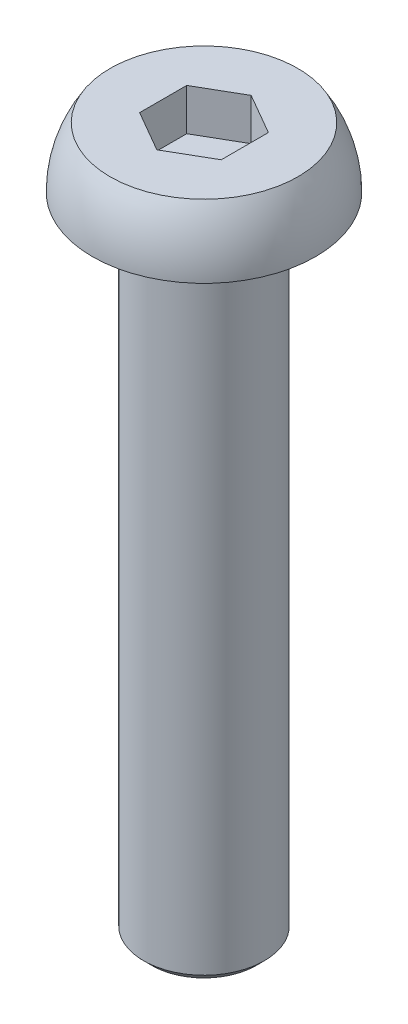
ISO-10303-21;
HEADER;
FILE_DESCRIPTION(('STEP AP214'),'2;1');
FILE_NAME('part.step','',(''),(''),'','','');
FILE_SCHEMA(('AUTOMOTIVE_DESIGN { 1 0 10303 214 1 1 1 1 }'));
ENDSEC;
DATA;
#1=APPLICATION_CONTEXT('core data for automotive mechanical design processes');
#2=APPLICATION_PROTOCOL_DEFINITION('international standard','automotive_design',2000,#1);
#3=PRODUCT_CONTEXT('',#1,'mechanical');
#4=PRODUCT('Part','Part','',(#3));
#5=PRODUCT_RELATED_PRODUCT_CATEGORY('part','',(#4));
#6=PRODUCT_DEFINITION_FORMATION('','',#4);
#7=PRODUCT_DEFINITION_CONTEXT('part definition',#1,'design');
#8=PRODUCT_DEFINITION('design','',#6,#7);
#9=PRODUCT_DEFINITION_SHAPE('','',#8);
#10=(LENGTH_UNIT() NAMED_UNIT(*) SI_UNIT(.MILLI.,.METRE.));
#11=(NAMED_UNIT(*) PLANE_ANGLE_UNIT() SI_UNIT($,.RADIAN.));
#12=(NAMED_UNIT(*) SI_UNIT($,.STERADIAN.) SOLID_ANGLE_UNIT());
#13=UNCERTAINTY_MEASURE_WITH_UNIT(LENGTH_MEASURE(1.E-05),#10,'distance_accuracy_value','');
#14=(GEOMETRIC_REPRESENTATION_CONTEXT(3) GLOBAL_UNCERTAINTY_ASSIGNED_CONTEXT((#13)) GLOBAL_UNIT_ASSIGNED_CONTEXT((#10,
#11,#12)) REPRESENTATION_CONTEXT('',''));
#15=CARTESIAN_POINT('',(0.,0.,0.));
#16=DIRECTION('',(0.,0.,1.));
#17=DIRECTION('',(1.,0.,0.));
#18=AXIS2_PLACEMENT_3D('',#15,#16,#17);
#19=CARTESIAN_POINT('',(-2.33465736244101,1.5,0.));
#20=DIRECTION('',(0.,1.,0.));
#21=DIRECTION('',(0.,0.,1.));
#22=AXIS2_PLACEMENT_3D('',#19,#20,#21);
#23=PLANE('',#22);
#24=DIRECTION('',(-0.866025403784439,0.,-0.5));
#25=VECTOR('',#24,1.);
#26=CARTESIAN_POINT('',(1.015,1.5,-0.58601052322747));
#27=LINE('',#26,#25);
#28=CARTESIAN_POINT('',(1.015,1.5,-0.58601052322747));
#29=VERTEX_POINT('',#28);
#30=CARTESIAN_POINT('',(0.,1.5,-1.17202104645494));
#31=VERTEX_POINT('',#30);
#32=EDGE_CURVE('E58',#29,#31,#27,.T.);
#33=ORIENTED_EDGE('',*,*,#32,.F.);
#34=DIRECTION('',(0.,0.,-1.));
#35=VECTOR('',#34,1.);
#36=CARTESIAN_POINT('',(1.015,1.5,0.58601052322747));
#37=LINE('',#36,#35);
#38=CARTESIAN_POINT('',(1.015,1.5,0.58601052322747));
#39=VERTEX_POINT('',#38);
#40=EDGE_CURVE('E151',#39,#29,#37,.T.);
#41=ORIENTED_EDGE('',*,*,#40,.F.);
#42=DIRECTION('',(0.866025403784439,0.,-0.5));
#43=VECTOR('',#42,1.);
#44=CARTESIAN_POINT('',(0.,1.5,1.17202104645494));
#45=LINE('',#44,#43);
#46=CARTESIAN_POINT('',(0.,1.5,1.17202104645494));
#47=VERTEX_POINT('',#46);
#48=EDGE_CURVE('E148',#47,#39,#45,.T.);
#49=ORIENTED_EDGE('',*,*,#48,.F.);
#50=DIRECTION('',(0.866025403784439,0.,0.5));
#51=VECTOR('',#50,1.);
#52=CARTESIAN_POINT('',(-1.015,1.5,0.58601052322747));
#53=LINE('',#52,#51);
#54=CARTESIAN_POINT('',(-1.015,1.5,0.58601052322747));
#55=VERTEX_POINT('',#54);
#56=EDGE_CURVE('E106',#55,#47,#53,.T.);
#57=ORIENTED_EDGE('',*,*,#56,.F.);
#58=DIRECTION('',(0.,0.,1.));
#59=VECTOR('',#58,1.);
#60=CARTESIAN_POINT('',(-1.015,1.5,-0.58601052322747));
#61=LINE('',#60,#59);
#62=CARTESIAN_POINT('',(-1.015,1.5,-0.58601052322747));
#63=VERTEX_POINT('',#62);
#64=EDGE_CURVE('E142',#63,#55,#61,.T.);
#65=ORIENTED_EDGE('',*,*,#64,.F.);
#66=DIRECTION('',(-0.866025403784439,0.,0.5));
#67=VECTOR('',#66,1.);
#68=CARTESIAN_POINT('',(0.,1.5,-1.17202104645494));
#69=LINE('',#68,#67);
#70=EDGE_CURVE('E138',#31,#63,#69,.T.);
#71=ORIENTED_EDGE('',*,*,#70,.F.);
#72=EDGE_LOOP('',(#33,#41,#49,#57,#65,#71));
#73=FACE_BOUND('',#72,.T.);
#74=CARTESIAN_POINT('',(0.,1.5,0.));
#75=DIRECTION('',(0.,1.,0.));
#76=DIRECTION('',(0.,0.,1.));
#77=AXIS2_PLACEMENT_3D('',#74,#75,#76);
#78=CIRCLE('',#77,2.33465736244101);
#79=CARTESIAN_POINT('',(0.,1.5,2.33465736244101));
#80=VERTEX_POINT('',#79);
#81=EDGE_CURVE('E171',#80,#80,#78,.T.);
#82=ORIENTED_EDGE('',*,*,#81,.T.);
#83=EDGE_LOOP('',(#82));
#84=FACE_BOUND('',#83,.T.);
#85=ADVANCED_FACE('F41',(#73,#84),#23,.T.);
#86=CARTESIAN_POINT('',(0.,0.,0.));
#87=DIRECTION('',(0.,1.,0.));
#88=DIRECTION('',(-1.,0.,0.));
#89=AXIS2_PLACEMENT_3D('',#86,#87,#88);
#90=SPHERICAL_SURFACE('',#89,2.775);
#91=CARTESIAN_POINT('',(0.,0.,0.));
#92=DIRECTION('',(0.,1.,0.));
#93=DIRECTION('',(0.,0.,1.));
#94=AXIS2_PLACEMENT_3D('',#91,#92,#93);
#95=CIRCLE('',#94,2.775);
#96=CARTESIAN_POINT('',(0.,0.,2.775));
#97=VERTEX_POINT('',#96);
#98=EDGE_CURVE('E157',#97,#97,#95,.T.);
#99=ORIENTED_EDGE('',*,*,#98,.T.);
#100=EDGE_LOOP('',(#99));
#101=FACE_BOUND('',#100,.T.);
#102=ORIENTED_EDGE('',*,*,#81,.F.);
#103=EDGE_LOOP('',(#102));
#104=FACE_BOUND('',#103,.T.);
#105=ADVANCED_FACE('F192',(#101,#104),#90,.T.);
#106=CARTESIAN_POINT('',(0.,0.,0.));
#107=DIRECTION('',(0.,-1.,0.));
#108=DIRECTION('',(0.,0.,-1.));
#109=AXIS2_PLACEMENT_3D('',#106,#107,#108);
#110=PLANE('',#109);
#111=CARTESIAN_POINT('',(0.,0.,0.));
#112=DIRECTION('',(0.,-1.,0.));
#113=DIRECTION('',(0.,0.,-1.));
#114=AXIS2_PLACEMENT_3D('',#111,#112,#113);
#115=CIRCLE('',#114,1.5);
#116=CARTESIAN_POINT('',(0.,0.,-1.5));
#117=VERTEX_POINT('',#116);
#118=EDGE_CURVE('E167',#117,#117,#115,.T.);
#119=ORIENTED_EDGE('',*,*,#118,.F.);
#120=EDGE_LOOP('',(#119));
#121=FACE_BOUND('',#120,.T.);
#122=ORIENTED_EDGE('',*,*,#98,.F.);
#123=EDGE_LOOP('',(#122));
#124=FACE_BOUND('',#123,.T.);
#125=ADVANCED_FACE('F197',(#121,#124),#110,.T.);
#126=CARTESIAN_POINT('',(0.,-16.,0.));
#127=DIRECTION('',(0.,1.,0.));
#128=DIRECTION('',(0.,0.,1.));
#129=AXIS2_PLACEMENT_3D('',#126,#127,#128);
#130=CYLINDRICAL_SURFACE('',#129,1.5);
#131=CARTESIAN_POINT('',(0.,-15.8,0.));
#132=DIRECTION('',(0.,-1.,0.));
#133=DIRECTION('',(0.,0.,-1.));
#134=AXIS2_PLACEMENT_3D('',#131,#132,#133);
#135=CIRCLE('',#134,1.5);
#136=CARTESIAN_POINT('',(0.,-15.8,-1.5));
#137=VERTEX_POINT('',#136);
#138=EDGE_CURVE('E11',#137,#137,#135,.F.);
#139=ORIENTED_EDGE('',*,*,#138,.T.);
#140=EDGE_LOOP('',(#139));
#141=FACE_BOUND('',#140,.T.);
#142=ORIENTED_EDGE('',*,*,#118,.T.);
#143=EDGE_LOOP('',(#142));
#144=FACE_BOUND('',#143,.T.);
#145=ADVANCED_FACE('F204',(#141,#144),#130,.T.);
#146=CARTESIAN_POINT('',(0.,-16.,0.));
#147=DIRECTION('',(0.,-1.,0.));
#148=DIRECTION('',(0.,0.,-1.));
#149=AXIS2_PLACEMENT_3D('',#146,#147,#148);
#150=PLANE('',#149);
#151=CARTESIAN_POINT('',(0.,-16.,0.));
#152=DIRECTION('',(0.,-1.,0.));
#153=DIRECTION('',(0.,0.,-1.));
#154=AXIS2_PLACEMENT_3D('',#151,#152,#153);
#155=CIRCLE('',#154,1.3);
#156=CARTESIAN_POINT('',(0.,-16.,-1.3));
#157=VERTEX_POINT('',#156);
#158=EDGE_CURVE('E51',#157,#157,#155,.T.);
#159=ORIENTED_EDGE('',*,*,#158,.T.);
#160=EDGE_LOOP('',(#159));
#161=FACE_BOUND('',#160,.T.);
#162=ADVANCED_FACE('F181',(#161),#150,.T.);
#163=CARTESIAN_POINT('',(1.015,0.459999999999999,-0.58601052322747));
#164=DIRECTION('',(0.5,0.,-0.866025403784439));
#165=DIRECTION('',(-0.866025403784439,0.,-0.5));
#166=AXIS2_PLACEMENT_3D('',#163,#164,#165);
#167=PLANE('',#166);
#168=ORIENTED_EDGE('',*,*,#32,.T.);
#169=DIRECTION('',(0.,1.,0.));
#170=VECTOR('',#169,1.);
#171=CARTESIAN_POINT('',(0.,0.459999999999999,-1.17202104645494));
#172=LINE('',#171,#170);
#173=CARTESIAN_POINT('',(0.,0.459999999999999,-1.17202104645494));
#174=VERTEX_POINT('',#173);
#175=EDGE_CURVE('E88',#174,#31,#172,.T.);
#176=ORIENTED_EDGE('',*,*,#175,.F.);
#177=DIRECTION('',(-0.866025403784439,0.,-0.5));
#178=VECTOR('',#177,1.);
#179=CARTESIAN_POINT('',(1.015,0.459999999999999,-0.58601052322747));
#180=LINE('',#179,#178);
#181=CARTESIAN_POINT('',(1.015,0.459999999999999,-0.58601052322747));
#182=VERTEX_POINT('',#181);
#183=EDGE_CURVE('E154',#182,#174,#180,.T.);
#184=ORIENTED_EDGE('',*,*,#183,.F.);
#185=DIRECTION('',(0.,1.,0.));
#186=VECTOR('',#185,1.);
#187=CARTESIAN_POINT('',(1.015,0.459999999999999,-0.58601052322747));
#188=LINE('',#187,#186);
#189=EDGE_CURVE('E66',#182,#29,#188,.T.);
#190=ORIENTED_EDGE('',*,*,#189,.T.);
#191=EDGE_LOOP('',(#168,#176,#184,#190));
#192=FACE_BOUND('',#191,.T.);
#193=ADVANCED_FACE('F211',(#192),#167,.F.);
#194=CARTESIAN_POINT('',(1.015,0.459999999999999,0.58601052322747));
#195=DIRECTION('',(1.,0.,0.));
#196=DIRECTION('',(0.,0.,-1.));
#197=AXIS2_PLACEMENT_3D('',#194,#195,#196);
#198=PLANE('',#197);
#199=ORIENTED_EDGE('',*,*,#40,.T.);
#200=ORIENTED_EDGE('',*,*,#189,.F.);
#201=DIRECTION('',(0.,0.,-1.));
#202=VECTOR('',#201,1.);
#203=CARTESIAN_POINT('',(1.015,0.459999999999999,0.58601052322747));
#204=LINE('',#203,#202);
#205=CARTESIAN_POINT('',(1.015,0.459999999999999,0.58601052322747));
#206=VERTEX_POINT('',#205);
#207=EDGE_CURVE('E120',#206,#182,#204,.T.);
#208=ORIENTED_EDGE('',*,*,#207,.F.);
#209=DIRECTION('',(0.,1.,0.));
#210=VECTOR('',#209,1.);
#211=CARTESIAN_POINT('',(1.015,0.459999999999999,0.58601052322747));
#212=LINE('',#211,#210);
#213=EDGE_CURVE('E111',#206,#39,#212,.T.);
#214=ORIENTED_EDGE('',*,*,#213,.T.);
#215=EDGE_LOOP('',(#199,#200,#208,#214));
#216=FACE_BOUND('',#215,.T.);
#217=ADVANCED_FACE('F214',(#216),#198,.F.);
#218=CARTESIAN_POINT('',(0.,0.459999999999999,1.17202104645494));
#219=DIRECTION('',(0.5,0.,0.866025403784439));
#220=DIRECTION('',(0.866025403784439,0.,-0.5));
#221=AXIS2_PLACEMENT_3D('',#218,#219,#220);
#222=PLANE('',#221);
#223=ORIENTED_EDGE('',*,*,#48,.T.);
#224=ORIENTED_EDGE('',*,*,#213,.F.);
#225=DIRECTION('',(0.866025403784439,0.,-0.5));
#226=VECTOR('',#225,1.);
#227=CARTESIAN_POINT('',(0.,0.459999999999999,1.17202104645494));
#228=LINE('',#227,#226);
#229=CARTESIAN_POINT('',(0.,0.459999999999999,1.17202104645494));
#230=VERTEX_POINT('',#229);
#231=EDGE_CURVE('E115',#230,#206,#228,.T.);
#232=ORIENTED_EDGE('',*,*,#231,.F.);
#233=DIRECTION('',(0.,1.,0.));
#234=VECTOR('',#233,1.);
#235=CARTESIAN_POINT('',(0.,0.459999999999999,1.17202104645494));
#236=LINE('',#235,#234);
#237=EDGE_CURVE('E99',#230,#47,#236,.T.);
#238=ORIENTED_EDGE('',*,*,#237,.T.);
#239=EDGE_LOOP('',(#223,#224,#232,#238));
#240=FACE_BOUND('',#239,.T.);
#241=ADVANCED_FACE('F116',(#240),#222,.F.);
#242=CARTESIAN_POINT('',(-1.015,0.459999999999999,0.58601052322747));
#243=DIRECTION('',(-0.5,0.,0.866025403784439));
#244=DIRECTION('',(0.866025403784439,0.,0.5));
#245=AXIS2_PLACEMENT_3D('',#242,#243,#244);
#246=PLANE('',#245);
#247=ORIENTED_EDGE('',*,*,#56,.T.);
#248=ORIENTED_EDGE('',*,*,#237,.F.);
#249=DIRECTION('',(0.866025403784439,0.,0.5));
#250=VECTOR('',#249,1.);
#251=CARTESIAN_POINT('',(-1.015,0.459999999999999,0.58601052322747));
#252=LINE('',#251,#250);
#253=CARTESIAN_POINT('',(-1.015,0.459999999999999,0.58601052322747));
#254=VERTEX_POINT('',#253);
#255=EDGE_CURVE('E103',#254,#230,#252,.T.);
#256=ORIENTED_EDGE('',*,*,#255,.F.);
#257=DIRECTION('',(0.,1.,0.));
#258=VECTOR('',#257,1.);
#259=CARTESIAN_POINT('',(-1.015,0.459999999999999,0.58601052322747));
#260=LINE('',#259,#258);
#261=EDGE_CURVE('E112',#254,#55,#260,.T.);
#262=ORIENTED_EDGE('',*,*,#261,.T.);
#263=EDGE_LOOP('',(#247,#248,#256,#262));
#264=FACE_BOUND('',#263,.T.);
#265=ADVANCED_FACE('F101',(#264),#246,.F.);
#266=CARTESIAN_POINT('',(-1.015,0.459999999999999,-0.58601052322747));
#267=DIRECTION('',(-1.,0.,0.));
#268=DIRECTION('',(0.,0.,1.));
#269=AXIS2_PLACEMENT_3D('',#266,#267,#268);
#270=PLANE('',#269);
#271=ORIENTED_EDGE('',*,*,#64,.T.);
#272=ORIENTED_EDGE('',*,*,#261,.F.);
#273=DIRECTION('',(0.,0.,1.));
#274=VECTOR('',#273,1.);
#275=CARTESIAN_POINT('',(-1.015,0.459999999999999,-0.58601052322747));
#276=LINE('',#275,#274);
#277=CARTESIAN_POINT('',(-1.015,0.459999999999999,-0.58601052322747));
#278=VERTEX_POINT('',#277);
#279=EDGE_CURVE('E126',#278,#254,#276,.T.);
#280=ORIENTED_EDGE('',*,*,#279,.F.);
#281=DIRECTION('',(0.,1.,0.));
#282=VECTOR('',#281,1.);
#283=CARTESIAN_POINT('',(-1.015,0.459999999999999,-0.58601052322747));
#284=LINE('',#283,#282);
#285=EDGE_CURVE('E162',#278,#63,#284,.T.);
#286=ORIENTED_EDGE('',*,*,#285,.T.);
#287=EDGE_LOOP('',(#271,#272,#280,#286));
#288=FACE_BOUND('',#287,.T.);
#289=ADVANCED_FACE('F217',(#288),#270,.F.);
#290=CARTESIAN_POINT('',(0.,0.459999999999999,-1.17202104645494));
#291=DIRECTION('',(-0.5,0.,-0.866025403784439));
#292=DIRECTION('',(-0.866025403784439,0.,0.5));
#293=AXIS2_PLACEMENT_3D('',#290,#291,#292);
#294=PLANE('',#293);
#295=ORIENTED_EDGE('',*,*,#70,.T.);
#296=ORIENTED_EDGE('',*,*,#285,.F.);
#297=DIRECTION('',(-0.866025403784439,0.,0.5));
#298=VECTOR('',#297,1.);
#299=CARTESIAN_POINT('',(0.,0.459999999999999,-1.17202104645494));
#300=LINE('',#299,#298);
#301=EDGE_CURVE('E130',#174,#278,#300,.T.);
#302=ORIENTED_EDGE('',*,*,#301,.F.);
#303=ORIENTED_EDGE('',*,*,#175,.T.);
#304=EDGE_LOOP('',(#295,#296,#302,#303));
#305=FACE_BOUND('',#304,.T.);
#306=ADVANCED_FACE('F188',(#305),#294,.F.);
#307=CARTESIAN_POINT('',(0.,0.459999999999999,0.));
#308=DIRECTION('',(0.,1.,0.));
#309=DIRECTION('',(0.,0.,1.));
#310=AXIS2_PLACEMENT_3D('',#307,#308,#309);
#311=PLANE('',#310);
#312=ORIENTED_EDGE('',*,*,#183,.T.);
#313=ORIENTED_EDGE('',*,*,#301,.T.);
#314=ORIENTED_EDGE('',*,*,#279,.T.);
#315=ORIENTED_EDGE('',*,*,#255,.T.);
#316=ORIENTED_EDGE('',*,*,#231,.T.);
#317=ORIENTED_EDGE('',*,*,#207,.T.);
#318=EDGE_LOOP('',(#312,#313,#314,#315,#316,#317));
#319=FACE_BOUND('',#318,.T.);
#320=ADVANCED_FACE('F123',(#319),#311,.T.);
#321=CARTESIAN_POINT('',(0.,-16.,0.));
#322=DIRECTION('',(0.,1.,0.));
#323=DIRECTION('',(0.,0.,1.));
#324=AXIS2_PLACEMENT_3D('',#321,#322,#323);
#325=CONICAL_SURFACE('',#324,1.3,0.785398163397441);
#326=ORIENTED_EDGE('',*,*,#138,.F.);
#327=EDGE_LOOP('',(#326));
#328=FACE_BOUND('',#327,.T.);
#329=ORIENTED_EDGE('',*,*,#158,.F.);
#330=EDGE_LOOP('',(#329));
#331=FACE_BOUND('',#330,.T.);
#332=ADVANCED_FACE('F44',(#328,#331),#325,.T.);
#333=CLOSED_SHELL('',(#85,#105,#125,#145,#162,#193,#217,#241,#265,#289,#306,#320,#332));
#334=MANIFOLD_SOLID_BREP('B2',#333);
#335=ADVANCED_BREP_SHAPE_REPRESENTATION('',(#18,#334),#14);
#336=SHAPE_DEFINITION_REPRESENTATION(#9,#335);
ENDSEC;
END-ISO-10303-21;
